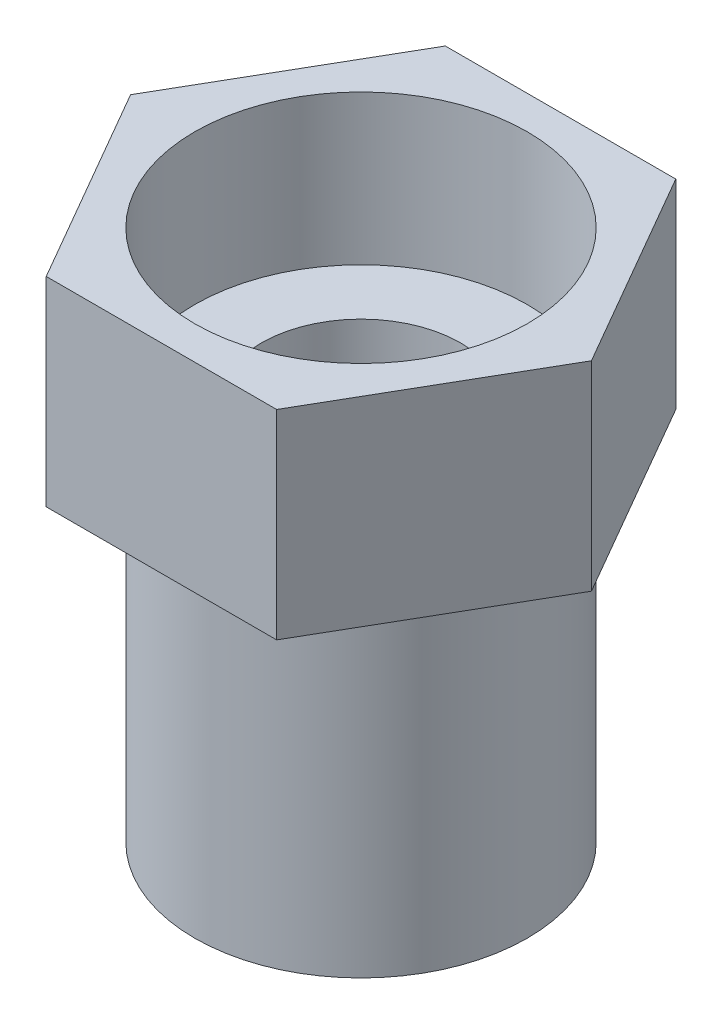
ISO-10303-21;
HEADER;
FILE_DESCRIPTION(('STEP AP214'),'2;1');
FILE_NAME('part.step','',(''),(''),'','','');
FILE_SCHEMA(('AUTOMOTIVE_DESIGN { 1 0 10303 214 1 1 1 1 }'));
ENDSEC;
DATA;
#1=APPLICATION_CONTEXT('core data for automotive mechanical design processes');
#2=APPLICATION_PROTOCOL_DEFINITION('international standard','automotive_design',2000,#1);
#3=PRODUCT_CONTEXT('',#1,'mechanical');
#4=PRODUCT('Part','Part','',(#3));
#5=PRODUCT_RELATED_PRODUCT_CATEGORY('part','',(#4));
#6=PRODUCT_DEFINITION_FORMATION('','',#4);
#7=PRODUCT_DEFINITION_CONTEXT('part definition',#1,'design');
#8=PRODUCT_DEFINITION('design','',#6,#7);
#9=PRODUCT_DEFINITION_SHAPE('','',#8);
#10=(LENGTH_UNIT() NAMED_UNIT(*) SI_UNIT(.MILLI.,.METRE.));
#11=(NAMED_UNIT(*) PLANE_ANGLE_UNIT() SI_UNIT($,.RADIAN.));
#12=(NAMED_UNIT(*) SI_UNIT($,.STERADIAN.) SOLID_ANGLE_UNIT());
#13=UNCERTAINTY_MEASURE_WITH_UNIT(LENGTH_MEASURE(1.E-05),#10,'distance_accuracy_value','');
#14=(GEOMETRIC_REPRESENTATION_CONTEXT(3) GLOBAL_UNCERTAINTY_ASSIGNED_CONTEXT((#13)) GLOBAL_UNIT_ASSIGNED_CONTEXT((#10,
#11,#12)) REPRESENTATION_CONTEXT('',''));
#15=CARTESIAN_POINT('',(0.,0.,0.));
#16=DIRECTION('',(0.,0.,1.));
#17=DIRECTION('',(1.,0.,0.));
#18=AXIS2_PLACEMENT_3D('',#15,#16,#17);
#19=CARTESIAN_POINT('',(3.46410161513775,3.,6.));
#20=DIRECTION('',(-0.866025403784439,0.,-0.5));
#21=DIRECTION('',(-0.5,0.,0.866025403784439));
#22=AXIS2_PLACEMENT_3D('',#19,#20,#21);
#23=PLANE('',#22);
#24=DIRECTION('',(0.5,0.,-0.866025403784439));
#25=VECTOR('',#24,1.);
#26=CARTESIAN_POINT('',(3.46410161513775,-3.,6.));
#27=LINE('',#26,#25);
#28=CARTESIAN_POINT('',(3.46410161513775,-3.,6.));
#29=VERTEX_POINT('',#28);
#30=CARTESIAN_POINT('',(6.92820323027551,-3.,0.));
#31=VERTEX_POINT('',#30);
#32=EDGE_CURVE('E119',#29,#31,#27,.T.);
#33=ORIENTED_EDGE('',*,*,#32,.T.);
#34=DIRECTION('',(0.,-1.,0.));
#35=VECTOR('',#34,1.);
#36=CARTESIAN_POINT('',(6.92820323027551,3.,0.));
#37=LINE('',#36,#35);
#38=CARTESIAN_POINT('',(6.92820323027551,3.,0.));
#39=VERTEX_POINT('',#38);
#40=EDGE_CURVE('E42',#39,#31,#37,.T.);
#41=ORIENTED_EDGE('',*,*,#40,.F.);
#42=DIRECTION('',(0.5,0.,-0.866025403784439));
#43=VECTOR('',#42,1.);
#44=CARTESIAN_POINT('',(3.46410161513775,3.,6.));
#45=LINE('',#44,#43);
#46=CARTESIAN_POINT('',(3.46410161513775,3.,6.));
#47=VERTEX_POINT('',#46);
#48=EDGE_CURVE('E130',#47,#39,#45,.T.);
#49=ORIENTED_EDGE('',*,*,#48,.F.);
#50=DIRECTION('',(0.,-1.,0.));
#51=VECTOR('',#50,1.);
#52=CARTESIAN_POINT('',(3.46410161513775,3.,6.));
#53=LINE('',#52,#51);
#54=EDGE_CURVE('E115',#47,#29,#53,.T.);
#55=ORIENTED_EDGE('',*,*,#54,.T.);
#56=EDGE_LOOP('',(#33,#41,#49,#55));
#57=FACE_BOUND('',#56,.T.);
#58=ADVANCED_FACE('F34',(#57),#23,.F.);
#59=CARTESIAN_POINT('',(6.92820323027551,3.,0.));
#60=DIRECTION('',(-0.866025403784438,0.,0.5));
#61=DIRECTION('',(0.5,0.,0.866025403784439));
#62=AXIS2_PLACEMENT_3D('',#59,#60,#61);
#63=PLANE('',#62);
#64=DIRECTION('',(-0.5,0.,-0.866025403784439));
#65=VECTOR('',#64,1.);
#66=CARTESIAN_POINT('',(6.92820323027551,-3.,0.));
#67=LINE('',#66,#65);
#68=CARTESIAN_POINT('',(3.46410161513775,-3.,-6.));
#69=VERTEX_POINT('',#68);
#70=EDGE_CURVE('E122',#31,#69,#67,.T.);
#71=ORIENTED_EDGE('',*,*,#70,.T.);
#72=DIRECTION('',(0.,-1.,0.));
#73=VECTOR('',#72,1.);
#74=CARTESIAN_POINT('',(3.46410161513775,3.,-6.));
#75=LINE('',#74,#73);
#76=CARTESIAN_POINT('',(3.46410161513775,3.,-6.));
#77=VERTEX_POINT('',#76);
#78=EDGE_CURVE('E134',#77,#69,#75,.T.);
#79=ORIENTED_EDGE('',*,*,#78,.F.);
#80=DIRECTION('',(-0.5,0.,-0.866025403784439));
#81=VECTOR('',#80,1.);
#82=CARTESIAN_POINT('',(6.92820323027551,3.,0.));
#83=LINE('',#82,#81);
#84=EDGE_CURVE('E88',#39,#77,#83,.T.);
#85=ORIENTED_EDGE('',*,*,#84,.F.);
#86=ORIENTED_EDGE('',*,*,#40,.T.);
#87=EDGE_LOOP('',(#71,#79,#85,#86));
#88=FACE_BOUND('',#87,.T.);
#89=ADVANCED_FACE('F137',(#88),#63,.F.);
#90=CARTESIAN_POINT('',(3.46410161513775,3.,-6.));
#91=DIRECTION('',(0.,0.,1.));
#92=DIRECTION('',(1.,0.,0.));
#93=AXIS2_PLACEMENT_3D('',#90,#91,#92);
#94=PLANE('',#93);
#95=DIRECTION('',(-1.,0.,0.));
#96=VECTOR('',#95,1.);
#97=CARTESIAN_POINT('',(3.46410161513775,-3.,-6.));
#98=LINE('',#97,#96);
#99=CARTESIAN_POINT('',(-3.46410161513775,-3.,-6.));
#100=VERTEX_POINT('',#99);
#101=EDGE_CURVE('E125',#69,#100,#98,.T.);
#102=ORIENTED_EDGE('',*,*,#101,.T.);
#103=DIRECTION('',(0.,-1.,0.));
#104=VECTOR('',#103,1.);
#105=CARTESIAN_POINT('',(-3.46410161513775,3.,-6.));
#106=LINE('',#105,#104);
#107=CARTESIAN_POINT('',(-3.46410161513775,3.,-6.));
#108=VERTEX_POINT('',#107);
#109=EDGE_CURVE('E110',#108,#100,#106,.T.);
#110=ORIENTED_EDGE('',*,*,#109,.F.);
#111=DIRECTION('',(-1.,0.,0.));
#112=VECTOR('',#111,1.);
#113=CARTESIAN_POINT('',(3.46410161513775,3.,-6.));
#114=LINE('',#113,#112);
#115=EDGE_CURVE('E101',#77,#108,#114,.T.);
#116=ORIENTED_EDGE('',*,*,#115,.F.);
#117=ORIENTED_EDGE('',*,*,#78,.T.);
#118=EDGE_LOOP('',(#102,#110,#116,#117));
#119=FACE_BOUND('',#118,.T.);
#120=ADVANCED_FACE('F145',(#119),#94,.F.);
#121=CARTESIAN_POINT('',(-3.46410161513775,3.,-6.));
#122=DIRECTION('',(0.866025403784439,0.,0.5));
#123=DIRECTION('',(0.5,0.,-0.866025403784439));
#124=AXIS2_PLACEMENT_3D('',#121,#122,#123);
#125=PLANE('',#124);
#126=DIRECTION('',(-0.5,0.,0.866025403784439));
#127=VECTOR('',#126,1.);
#128=CARTESIAN_POINT('',(-3.46410161513775,-3.,-6.));
#129=LINE('',#128,#127);
#130=CARTESIAN_POINT('',(-6.92820323027551,-3.,0.));
#131=VERTEX_POINT('',#130);
#132=EDGE_CURVE('E109',#100,#131,#129,.T.);
#133=ORIENTED_EDGE('',*,*,#132,.T.);
#134=DIRECTION('',(0.,-1.,0.));
#135=VECTOR('',#134,1.);
#136=CARTESIAN_POINT('',(-6.92820323027551,3.,0.));
#137=LINE('',#136,#135);
#138=CARTESIAN_POINT('',(-6.92820323027551,3.,0.));
#139=VERTEX_POINT('',#138);
#140=EDGE_CURVE('E106',#139,#131,#137,.T.);
#141=ORIENTED_EDGE('',*,*,#140,.F.);
#142=DIRECTION('',(-0.5,0.,0.866025403784439));
#143=VECTOR('',#142,1.);
#144=CARTESIAN_POINT('',(-3.46410161513775,3.,-6.));
#145=LINE('',#144,#143);
#146=EDGE_CURVE('E95',#108,#139,#145,.T.);
#147=ORIENTED_EDGE('',*,*,#146,.F.);
#148=ORIENTED_EDGE('',*,*,#109,.T.);
#149=EDGE_LOOP('',(#133,#141,#147,#148));
#150=FACE_BOUND('',#149,.T.);
#151=ADVANCED_FACE('F107',(#150),#125,.F.);
#152=CARTESIAN_POINT('',(-6.92820323027551,3.,0.));
#153=DIRECTION('',(0.866025403784439,0.,-0.5));
#154=DIRECTION('',(-0.5,0.,-0.866025403784439));
#155=AXIS2_PLACEMENT_3D('',#152,#153,#154);
#156=PLANE('',#155);
#157=DIRECTION('',(0.5,0.,0.866025403784439));
#158=VECTOR('',#157,1.);
#159=CARTESIAN_POINT('',(-6.92820323027551,-3.,0.));
#160=LINE('',#159,#158);
#161=CARTESIAN_POINT('',(-3.46410161513776,-3.,6.));
#162=VERTEX_POINT('',#161);
#163=EDGE_CURVE('E73',#131,#162,#160,.T.);
#164=ORIENTED_EDGE('',*,*,#163,.T.);
#165=DIRECTION('',(0.,-1.,0.));
#166=VECTOR('',#165,1.);
#167=CARTESIAN_POINT('',(-3.46410161513776,3.,6.));
#168=LINE('',#167,#166);
#169=CARTESIAN_POINT('',(-3.46410161513776,3.,6.));
#170=VERTEX_POINT('',#169);
#171=EDGE_CURVE('E111',#170,#162,#168,.T.);
#172=ORIENTED_EDGE('',*,*,#171,.F.);
#173=DIRECTION('',(0.5,0.,0.866025403784439));
#174=VECTOR('',#173,1.);
#175=CARTESIAN_POINT('',(-6.92820323027551,3.,0.));
#176=LINE('',#175,#174);
#177=EDGE_CURVE('E99',#139,#170,#176,.T.);
#178=ORIENTED_EDGE('',*,*,#177,.F.);
#179=ORIENTED_EDGE('',*,*,#140,.T.);
#180=EDGE_LOOP('',(#164,#172,#178,#179));
#181=FACE_BOUND('',#180,.T.);
#182=ADVANCED_FACE('F113',(#181),#156,.F.);
#183=CARTESIAN_POINT('',(-3.46410161513776,3.,6.));
#184=DIRECTION('',(0.,0.,-1.));
#185=DIRECTION('',(-1.,0.,0.));
#186=AXIS2_PLACEMENT_3D('',#183,#184,#185);
#187=PLANE('',#186);
#188=DIRECTION('',(1.,0.,0.));
#189=VECTOR('',#188,1.);
#190=CARTESIAN_POINT('',(-3.46410161513776,-3.,6.));
#191=LINE('',#190,#189);
#192=EDGE_CURVE('E79',#162,#29,#191,.T.);
#193=ORIENTED_EDGE('',*,*,#192,.T.);
#194=ORIENTED_EDGE('',*,*,#54,.F.);
#195=DIRECTION('',(1.,0.,0.));
#196=VECTOR('',#195,1.);
#197=CARTESIAN_POINT('',(-3.46410161513776,3.,6.));
#198=LINE('',#197,#196);
#199=EDGE_CURVE('E50',#170,#47,#198,.T.);
#200=ORIENTED_EDGE('',*,*,#199,.F.);
#201=ORIENTED_EDGE('',*,*,#171,.T.);
#202=EDGE_LOOP('',(#193,#194,#200,#201));
#203=FACE_BOUND('',#202,.T.);
#204=ADVANCED_FACE('F167',(#203),#187,.F.);
#205=CARTESIAN_POINT('',(0.,3.,0.));
#206=DIRECTION('',(0.,1.,0.));
#207=DIRECTION('',(0.,0.,1.));
#208=AXIS2_PLACEMENT_3D('',#205,#206,#207);
#209=PLANE('',#208);
#210=CARTESIAN_POINT('',(0.,3.,0.));
#211=DIRECTION('',(0.,1.,0.));
#212=DIRECTION('',(0.,0.,1.));
#213=AXIS2_PLACEMENT_3D('',#210,#211,#212);
#214=CIRCLE('',#213,5.);
#215=CARTESIAN_POINT('',(0.,3.,5.));
#216=VERTEX_POINT('',#215);
#217=EDGE_CURVE('E160',#216,#216,#214,.T.);
#218=ORIENTED_EDGE('',*,*,#217,.F.);
#219=EDGE_LOOP('',(#218));
#220=FACE_BOUND('',#219,.T.);
#221=ORIENTED_EDGE('',*,*,#48,.T.);
#222=ORIENTED_EDGE('',*,*,#84,.T.);
#223=ORIENTED_EDGE('',*,*,#115,.T.);
#224=ORIENTED_EDGE('',*,*,#146,.T.);
#225=ORIENTED_EDGE('',*,*,#177,.T.);
#226=ORIENTED_EDGE('',*,*,#199,.T.);
#227=EDGE_LOOP('',(#221,#222,#223,#224,#225,#226));
#228=FACE_BOUND('',#227,.T.);
#229=ADVANCED_FACE('F97',(#220,#228),#209,.T.);
#230=CARTESIAN_POINT('',(0.,-3.,0.));
#231=DIRECTION('',(0.,1.,0.));
#232=DIRECTION('',(0.,0.,1.));
#233=AXIS2_PLACEMENT_3D('',#230,#231,#232);
#234=PLANE('',#233);
#235=CARTESIAN_POINT('',(0.,-3.,0.));
#236=DIRECTION('',(0.,1.,0.));
#237=DIRECTION('',(0.,0.,1.));
#238=AXIS2_PLACEMENT_3D('',#235,#236,#237);
#239=CIRCLE('',#238,5.);
#240=CARTESIAN_POINT('',(0.,-3.,5.));
#241=VERTEX_POINT('',#240);
#242=EDGE_CURVE('E11',#241,#241,#239,.F.);
#243=ORIENTED_EDGE('',*,*,#242,.F.);
#244=EDGE_LOOP('',(#243));
#245=FACE_BOUND('',#244,.T.);
#246=ORIENTED_EDGE('',*,*,#32,.F.);
#247=ORIENTED_EDGE('',*,*,#192,.F.);
#248=ORIENTED_EDGE('',*,*,#163,.F.);
#249=ORIENTED_EDGE('',*,*,#132,.F.);
#250=ORIENTED_EDGE('',*,*,#101,.F.);
#251=ORIENTED_EDGE('',*,*,#70,.F.);
#252=EDGE_LOOP('',(#246,#247,#248,#249,#250,#251));
#253=FACE_BOUND('',#252,.T.);
#254=ADVANCED_FACE('F142',(#245,#253),#234,.F.);
#255=CARTESIAN_POINT('',(0.,-13.,0.));
#256=DIRECTION('',(0.,1.,0.));
#257=DIRECTION('',(0.,0.,1.));
#258=AXIS2_PLACEMENT_3D('',#255,#256,#257);
#259=CYLINDRICAL_SURFACE('',#258,5.);
#260=CARTESIAN_POINT('',(0.,-13.,0.));
#261=DIRECTION('',(0.,-1.,0.));
#262=DIRECTION('',(0.,0.,-1.));
#263=AXIS2_PLACEMENT_3D('',#260,#261,#262);
#264=CIRCLE('',#263,5.);
#265=CARTESIAN_POINT('',(0.,-13.,-5.));
#266=VERTEX_POINT('',#265);
#267=EDGE_CURVE('E123',#266,#266,#264,.T.);
#268=ORIENTED_EDGE('',*,*,#267,.F.);
#269=EDGE_LOOP('',(#268));
#270=FACE_BOUND('',#269,.T.);
#271=ORIENTED_EDGE('',*,*,#242,.T.);
#272=EDGE_LOOP('',(#271));
#273=FACE_BOUND('',#272,.T.);
#274=ADVANCED_FACE('F173',(#270,#273),#259,.T.);
#275=CARTESIAN_POINT('',(0.,-13.,0.));
#276=DIRECTION('',(0.,-1.,0.));
#277=DIRECTION('',(0.,0.,-1.));
#278=AXIS2_PLACEMENT_3D('',#275,#276,#277);
#279=PLANE('',#278);
#280=CARTESIAN_POINT('',(0.,-13.,0.));
#281=DIRECTION('',(0.,1.,0.));
#282=DIRECTION('',(0.,0.,1.));
#283=AXIS2_PLACEMENT_3D('',#280,#281,#282);
#284=CIRCLE('',#283,3.);
#285=CARTESIAN_POINT('',(0.,-13.,3.));
#286=VERTEX_POINT('',#285);
#287=EDGE_CURVE('E151',#286,#286,#284,.T.);
#288=ORIENTED_EDGE('',*,*,#287,.T.);
#289=EDGE_LOOP('',(#288));
#290=FACE_BOUND('',#289,.T.);
#291=ORIENTED_EDGE('',*,*,#267,.T.);
#292=EDGE_LOOP('',(#291));
#293=FACE_BOUND('',#292,.T.);
#294=ADVANCED_FACE('F213',(#290,#293),#279,.T.);
#295=CARTESIAN_POINT('',(0.,3.,0.));
#296=DIRECTION('',(0.,1.,0.));
#297=DIRECTION('',(0.,0.,1.));
#298=AXIS2_PLACEMENT_3D('',#295,#296,#297);
#299=CYLINDRICAL_SURFACE('',#298,3.);
#300=ORIENTED_EDGE('',*,*,#287,.F.);
#301=EDGE_LOOP('',(#300));
#302=FACE_BOUND('',#301,.T.);
#303=CARTESIAN_POINT('',(0.,-1.5,0.));
#304=DIRECTION('',(0.,1.,0.));
#305=DIRECTION('',(0.,0.,1.));
#306=AXIS2_PLACEMENT_3D('',#303,#304,#305);
#307=CIRCLE('',#306,3.);
#308=CARTESIAN_POINT('',(0.,-1.5,3.));
#309=VERTEX_POINT('',#308);
#310=EDGE_CURVE('E154',#309,#309,#307,.T.);
#311=ORIENTED_EDGE('',*,*,#310,.T.);
#312=EDGE_LOOP('',(#311));
#313=FACE_BOUND('',#312,.T.);
#314=ADVANCED_FACE('F226',(#302,#313),#299,.F.);
#315=CARTESIAN_POINT('',(3.,-1.5,0.));
#316=DIRECTION('',(0.,-1.,0.));
#317=DIRECTION('',(0.,0.,-1.));
#318=AXIS2_PLACEMENT_3D('',#315,#316,#317);
#319=PLANE('',#318);
#320=ORIENTED_EDGE('',*,*,#310,.F.);
#321=EDGE_LOOP('',(#320));
#322=FACE_BOUND('',#321,.T.);
#323=CARTESIAN_POINT('',(0.,-1.5,0.));
#324=DIRECTION('',(0.,1.,0.));
#325=DIRECTION('',(0.,0.,1.));
#326=AXIS2_PLACEMENT_3D('',#323,#324,#325);
#327=CIRCLE('',#326,5.);
#328=CARTESIAN_POINT('',(0.,-1.5,5.));
#329=VERTEX_POINT('',#328);
#330=EDGE_CURVE('E157',#329,#329,#327,.T.);
#331=ORIENTED_EDGE('',*,*,#330,.T.);
#332=EDGE_LOOP('',(#331));
#333=FACE_BOUND('',#332,.T.);
#334=ADVANCED_FACE('F236',(#322,#333),#319,.F.);
#335=CARTESIAN_POINT('',(0.,3.,0.));
#336=DIRECTION('',(0.,1.,0.));
#337=DIRECTION('',(0.,0.,1.));
#338=AXIS2_PLACEMENT_3D('',#335,#336,#337);
#339=CYLINDRICAL_SURFACE('',#338,5.);
#340=ORIENTED_EDGE('',*,*,#330,.F.);
#341=EDGE_LOOP('',(#340));
#342=FACE_BOUND('',#341,.T.);
#343=ORIENTED_EDGE('',*,*,#217,.T.);
#344=EDGE_LOOP('',(#343));
#345=FACE_BOUND('',#344,.T.);
#346=ADVANCED_FACE('F164',(#342,#345),#339,.F.);
#347=CLOSED_SHELL('',(#58,#89,#120,#151,#182,#204,#229,#254,#274,#294,#314,#334,#346));
#348=MANIFOLD_SOLID_BREP('B2',#347);
#349=ADVANCED_BREP_SHAPE_REPRESENTATION('',(#18,#348),#14);
#350=SHAPE_DEFINITION_REPRESENTATION(#9,#349);
ENDSEC;
END-ISO-10303-21;
